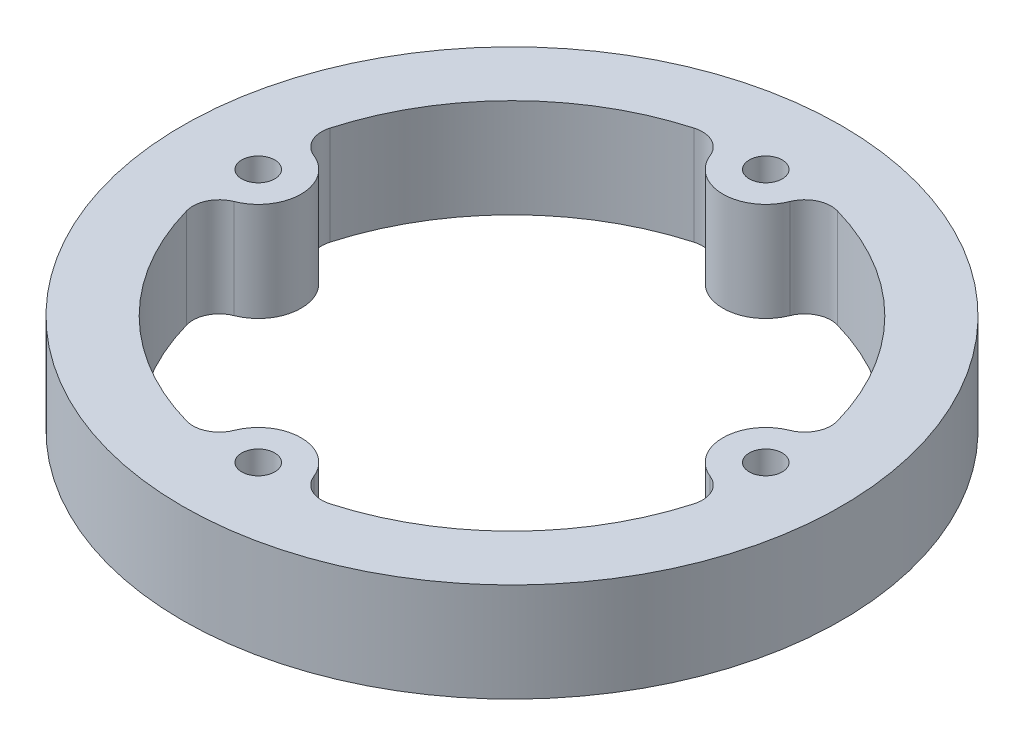
ISO-10303-21;
HEADER;
FILE_DESCRIPTION(('STEP AP214'),'2;1');
FILE_NAME('part.step','',(''),(''),'','','');
FILE_SCHEMA(('AUTOMOTIVE_DESIGN { 1 0 10303 214 1 1 1 1 }'));
ENDSEC;
DATA;
#1=APPLICATION_CONTEXT('core data for automotive mechanical design processes');
#2=APPLICATION_PROTOCOL_DEFINITION('international standard','automotive_design',2000,#1);
#3=PRODUCT_CONTEXT('',#1,'mechanical');
#4=PRODUCT('Part','Part','',(#3));
#5=PRODUCT_RELATED_PRODUCT_CATEGORY('part','',(#4));
#6=PRODUCT_DEFINITION_FORMATION('','',#4);
#7=PRODUCT_DEFINITION_CONTEXT('part definition',#1,'design');
#8=PRODUCT_DEFINITION('design','',#6,#7);
#9=PRODUCT_DEFINITION_SHAPE('','',#8);
#10=(LENGTH_UNIT() NAMED_UNIT(*) SI_UNIT(.MILLI.,.METRE.));
#11=(NAMED_UNIT(*) PLANE_ANGLE_UNIT() SI_UNIT($,.RADIAN.));
#12=(NAMED_UNIT(*) SI_UNIT($,.STERADIAN.) SOLID_ANGLE_UNIT());
#13=UNCERTAINTY_MEASURE_WITH_UNIT(LENGTH_MEASURE(1.E-05),#10,'distance_accuracy_value','');
#14=(GEOMETRIC_REPRESENTATION_CONTEXT(3) GLOBAL_UNCERTAINTY_ASSIGNED_CONTEXT((#13)) GLOBAL_UNIT_ASSIGNED_CONTEXT((#10,
#11,#12)) REPRESENTATION_CONTEXT('',''));
#15=CARTESIAN_POINT('',(0.,0.,0.));
#16=DIRECTION('',(0.,0.,1.));
#17=DIRECTION('',(1.,0.,0.));
#18=AXIS2_PLACEMENT_3D('',#15,#16,#17);
#19=CARTESIAN_POINT('',(0.,15.,0.));
#20=DIRECTION('',(0.,1.,0.));
#21=DIRECTION('',(0.,0.,1.));
#22=AXIS2_PLACEMENT_3D('',#19,#20,#21);
#23=PLANE('',#22);
#24=CARTESIAN_POINT('',(38.5,15.,0.));
#25=DIRECTION('',(0.,1.,0.));
#26=DIRECTION('',(0.,0.,1.));
#27=AXIS2_PLACEMENT_3D('',#24,#25,#26);
#28=CIRCLE('',#27,2.5);
#29=CARTESIAN_POINT('',(38.5,15.,2.5));
#30=VERTEX_POINT('',#29);
#31=EDGE_CURVE('E198',#30,#30,#28,.T.);
#32=ORIENTED_EDGE('',*,*,#31,.F.);
#33=EDGE_LOOP('',(#32));
#34=FACE_BOUND('',#33,.T.);
#35=CARTESIAN_POINT('',(-38.5,15.,0.));
#36=DIRECTION('',(0.,1.,0.));
#37=DIRECTION('',(0.,0.,-1.));
#38=AXIS2_PLACEMENT_3D('',#35,#36,#37);
#39=CIRCLE('',#38,2.5);
#40=CARTESIAN_POINT('',(-38.5,15.,-2.49999999999999));
#41=VERTEX_POINT('',#40);
#42=EDGE_CURVE('E204',#41,#41,#39,.T.);
#43=ORIENTED_EDGE('',*,*,#42,.F.);
#44=EDGE_LOOP('',(#43));
#45=FACE_BOUND('',#44,.T.);
#46=CARTESIAN_POINT('',(0.,15.,-38.5));
#47=DIRECTION('',(0.,1.,0.));
#48=DIRECTION('',(0.,0.,1.));
#49=AXIS2_PLACEMENT_3D('',#46,#47,#48);
#50=CIRCLE('',#49,2.5);
#51=CARTESIAN_POINT('',(0.,15.,-36.));
#52=VERTEX_POINT('',#51);
#53=EDGE_CURVE('E210',#52,#52,#50,.T.);
#54=ORIENTED_EDGE('',*,*,#53,.F.);
#55=EDGE_LOOP('',(#54));
#56=FACE_BOUND('',#55,.T.);
#57=CARTESIAN_POINT('',(0.,15.,38.5));
#58=DIRECTION('',(0.,1.,0.));
#59=DIRECTION('',(0.,0.,-1.));
#60=AXIS2_PLACEMENT_3D('',#57,#58,#59);
#61=CIRCLE('',#60,2.5);
#62=CARTESIAN_POINT('',(0.,15.,36.));
#63=VERTEX_POINT('',#62);
#64=EDGE_CURVE('E216',#63,#63,#61,.T.);
#65=ORIENTED_EDGE('',*,*,#64,.F.);
#66=EDGE_LOOP('',(#65));
#67=FACE_BOUND('',#66,.T.);
#68=CARTESIAN_POINT('',(0.,15.,0.));
#69=DIRECTION('',(0.,1.,0.));
#70=DIRECTION('',(0.,0.,1.));
#71=AXIS2_PLACEMENT_3D('',#68,#69,#70);
#72=CIRCLE('',#71,50.);
#73=CARTESIAN_POINT('',(0.,15.,50.));
#74=VERTEX_POINT('',#73);
#75=EDGE_CURVE('E220',#74,#74,#72,.T.);
#76=ORIENTED_EDGE('',*,*,#75,.T.);
#77=EDGE_LOOP('',(#76));
#78=FACE_BOUND('',#77,.T.);
#79=CARTESIAN_POINT('',(0.,15.,0.));
#80=DIRECTION('',(0.,1.,0.));
#81=DIRECTION('',(0.,0.,1.));
#82=AXIS2_PLACEMENT_3D('',#79,#80,#81);
#83=CIRCLE('',#82,40.);
#84=CARTESIAN_POINT('',(-38.4992784992785,15.,10.8538267461293));
#85=VERTEX_POINT('',#84);
#86=CARTESIAN_POINT('',(-10.8538267461293,15.,38.4992784992785));
#87=VERTEX_POINT('',#86);
#88=EDGE_CURVE('E187',#85,#87,#83,.T.);
#89=ORIENTED_EDGE('',*,*,#88,.F.);
#90=CARTESIAN_POINT('',(-34.6493506493507,15.,9.7684440715164));
#91=DIRECTION('',(0.,1.,0.));
#92=DIRECTION('',(0.,0.,1.));
#93=AXIS2_PLACEMENT_3D('',#90,#91,#92);
#94=CIRCLE('',#93,4.);
#95=CARTESIAN_POINT('',(-36.1162646876933,15.,6.04713204427206));
#96=VERTEX_POINT('',#95);
#97=EDGE_CURVE('E270',#85,#96,#94,.F.);
#98=ORIENTED_EDGE('',*,*,#97,.T.);
#99=CARTESIAN_POINT('',(-38.5,15.,0.));
#100=DIRECTION('',(0.,-1.,0.));
#101=DIRECTION('',(0.,0.,-1.));
#102=AXIS2_PLACEMENT_3D('',#99,#100,#101);
#103=CIRCLE('',#102,6.50000000000001);
#104=CARTESIAN_POINT('',(-36.1162646876933,15.,-6.04713204427206));
#105=VERTEX_POINT('',#104);
#106=EDGE_CURVE('E184',#105,#96,#103,.T.);
#107=ORIENTED_EDGE('',*,*,#106,.F.);
#108=CARTESIAN_POINT('',(-34.6493506493507,15.,-9.7684440715164));
#109=DIRECTION('',(0.,1.,0.));
#110=DIRECTION('',(0.,0.,1.));
#111=AXIS2_PLACEMENT_3D('',#108,#109,#110);
#112=CIRCLE('',#111,4.);
#113=CARTESIAN_POINT('',(-38.4992784992785,15.,-10.8538267461293));
#114=VERTEX_POINT('',#113);
#115=EDGE_CURVE('E274',#105,#114,#112,.F.);
#116=ORIENTED_EDGE('',*,*,#115,.T.);
#117=CARTESIAN_POINT('',(0.,15.,0.));
#118=DIRECTION('',(0.,1.,0.));
#119=DIRECTION('',(0.,0.,1.));
#120=AXIS2_PLACEMENT_3D('',#117,#118,#119);
#121=CIRCLE('',#120,40.);
#122=CARTESIAN_POINT('',(-10.8538267461294,15.,-38.4992784992785));
#123=VERTEX_POINT('',#122);
#124=EDGE_CURVE('E176',#123,#114,#121,.T.);
#125=ORIENTED_EDGE('',*,*,#124,.F.);
#126=CARTESIAN_POINT('',(-9.76844407151643,15.,-34.6493506493506));
#127=DIRECTION('',(0.,1.,0.));
#128=DIRECTION('',(0.,0.,1.));
#129=AXIS2_PLACEMENT_3D('',#126,#127,#128);
#130=CIRCLE('',#129,4.);
#131=CARTESIAN_POINT('',(-6.04713204427208,15.,-36.1162646876933));
#132=VERTEX_POINT('',#131);
#133=EDGE_CURVE('E52',#123,#132,#130,.F.);
#134=ORIENTED_EDGE('',*,*,#133,.T.);
#135=CARTESIAN_POINT('',(0.,15.,-38.5));
#136=DIRECTION('',(0.,-1.,0.));
#137=DIRECTION('',(0.,0.,-1.));
#138=AXIS2_PLACEMENT_3D('',#135,#136,#137);
#139=CIRCLE('',#138,6.5);
#140=CARTESIAN_POINT('',(6.04713204427203,15.,-36.1162646876933));
#141=VERTEX_POINT('',#140);
#142=EDGE_CURVE('E173',#141,#132,#139,.T.);
#143=ORIENTED_EDGE('',*,*,#142,.F.);
#144=CARTESIAN_POINT('',(9.76844407151637,15.,-34.6493506493507));
#145=DIRECTION('',(0.,1.,0.));
#146=DIRECTION('',(0.,0.,1.));
#147=AXIS2_PLACEMENT_3D('',#144,#145,#146);
#148=CIRCLE('',#147,4.);
#149=CARTESIAN_POINT('',(10.8538267461293,15.,-38.4992784992785));
#150=VERTEX_POINT('',#149);
#151=EDGE_CURVE('E45',#141,#150,#148,.F.);
#152=ORIENTED_EDGE('',*,*,#151,.T.);
#153=CARTESIAN_POINT('',(0.,15.,0.));
#154=DIRECTION('',(0.,1.,0.));
#155=DIRECTION('',(0.,0.,1.));
#156=AXIS2_PLACEMENT_3D('',#153,#154,#155);
#157=CIRCLE('',#156,40.);
#158=CARTESIAN_POINT('',(38.4992784992785,15.,-10.8538267461293));
#159=VERTEX_POINT('',#158);
#160=EDGE_CURVE('E166',#159,#150,#157,.T.);
#161=ORIENTED_EDGE('',*,*,#160,.F.);
#162=CARTESIAN_POINT('',(34.6493506493507,15.,-9.7684440715164));
#163=DIRECTION('',(0.,1.,0.));
#164=DIRECTION('',(0.,0.,1.));
#165=AXIS2_PLACEMENT_3D('',#162,#163,#164);
#166=CIRCLE('',#165,4.);
#167=CARTESIAN_POINT('',(36.1162646876933,15.,-6.04713204427206));
#168=VERTEX_POINT('',#167);
#169=EDGE_CURVE('E150',#159,#168,#166,.F.);
#170=ORIENTED_EDGE('',*,*,#169,.T.);
#171=CARTESIAN_POINT('',(38.5,15.,0.));
#172=DIRECTION('',(0.,-1.,0.));
#173=DIRECTION('',(0.,0.,1.));
#174=AXIS2_PLACEMENT_3D('',#171,#172,#173);
#175=CIRCLE('',#174,6.50000000000001);
#176=CARTESIAN_POINT('',(36.1162646876933,15.,6.04713204427206));
#177=VERTEX_POINT('',#176);
#178=EDGE_CURVE('E174',#177,#168,#175,.T.);
#179=ORIENTED_EDGE('',*,*,#178,.F.);
#180=CARTESIAN_POINT('',(34.6493506493507,15.,9.7684440715164));
#181=DIRECTION('',(0.,1.,0.));
#182=DIRECTION('',(0.,0.,1.));
#183=AXIS2_PLACEMENT_3D('',#180,#181,#182);
#184=CIRCLE('',#183,4.);
#185=CARTESIAN_POINT('',(38.4992784992785,15.,10.8538267461293));
#186=VERTEX_POINT('',#185);
#187=EDGE_CURVE('E258',#177,#186,#184,.F.);
#188=ORIENTED_EDGE('',*,*,#187,.T.);
#189=CARTESIAN_POINT('',(0.,15.,0.));
#190=DIRECTION('',(0.,1.,0.));
#191=DIRECTION('',(0.,0.,1.));
#192=AXIS2_PLACEMENT_3D('',#189,#190,#191);
#193=CIRCLE('',#192,40.);
#194=CARTESIAN_POINT('',(10.8538267461293,15.,38.4992784992785));
#195=VERTEX_POINT('',#194);
#196=EDGE_CURVE('E178',#195,#186,#193,.T.);
#197=ORIENTED_EDGE('',*,*,#196,.F.);
#198=CARTESIAN_POINT('',(9.7684440715164,15.,34.6493506493507));
#199=DIRECTION('',(0.,1.,0.));
#200=DIRECTION('',(0.,0.,1.));
#201=AXIS2_PLACEMENT_3D('',#198,#199,#200);
#202=CIRCLE('',#201,4.);
#203=CARTESIAN_POINT('',(6.04713204427205,15.,36.1162646876933));
#204=VERTEX_POINT('',#203);
#205=EDGE_CURVE('E262',#195,#204,#202,.F.);
#206=ORIENTED_EDGE('',*,*,#205,.T.);
#207=CARTESIAN_POINT('',(0.,15.,38.5));
#208=DIRECTION('',(0.,-1.,0.));
#209=DIRECTION('',(0.,0.,1.));
#210=AXIS2_PLACEMENT_3D('',#207,#208,#209);
#211=CIRCLE('',#210,6.5);
#212=CARTESIAN_POINT('',(-6.04713204427205,15.,36.1162646876933));
#213=VERTEX_POINT('',#212);
#214=EDGE_CURVE('E190',#213,#204,#211,.T.);
#215=ORIENTED_EDGE('',*,*,#214,.F.);
#216=CARTESIAN_POINT('',(-9.76844407151639,15.,34.6493506493507));
#217=DIRECTION('',(0.,1.,0.));
#218=DIRECTION('',(0.,0.,1.));
#219=AXIS2_PLACEMENT_3D('',#216,#217,#218);
#220=CIRCLE('',#219,4.);
#221=EDGE_CURVE('E266',#213,#87,#220,.F.);
#222=ORIENTED_EDGE('',*,*,#221,.T.);
#223=EDGE_LOOP('',(#89,#98,#107,#116,#125,#134,#143,#152,#161,#170,#179,#188,#197,#206,#215,#222));
#224=FACE_BOUND('',#223,.T.);
#225=ADVANCED_FACE('F37',(#34,#45,#56,#67,#78,#224),#23,.T.);
#226=CARTESIAN_POINT('',(0.,0.,0.));
#227=DIRECTION('',(0.,1.,0.));
#228=DIRECTION('',(0.,0.,1.));
#229=AXIS2_PLACEMENT_3D('',#226,#227,#228);
#230=PLANE('',#229);
#231=CARTESIAN_POINT('',(38.5,0.,0.));
#232=DIRECTION('',(0.,1.,0.));
#233=DIRECTION('',(0.,0.,1.));
#234=AXIS2_PLACEMENT_3D('',#231,#232,#233);
#235=CIRCLE('',#234,2.5);
#236=CARTESIAN_POINT('',(38.5,0.,2.5));
#237=VERTEX_POINT('',#236);
#238=EDGE_CURVE('E194',#237,#237,#235,.T.);
#239=ORIENTED_EDGE('',*,*,#238,.T.);
#240=EDGE_LOOP('',(#239));
#241=FACE_BOUND('',#240,.T.);
#242=CARTESIAN_POINT('',(-38.5,0.,0.));
#243=DIRECTION('',(0.,1.,0.));
#244=DIRECTION('',(0.,0.,-1.));
#245=AXIS2_PLACEMENT_3D('',#242,#243,#244);
#246=CIRCLE('',#245,2.5);
#247=CARTESIAN_POINT('',(-38.5,0.,-2.49999999999999));
#248=VERTEX_POINT('',#247);
#249=EDGE_CURVE('E201',#248,#248,#246,.T.);
#250=ORIENTED_EDGE('',*,*,#249,.T.);
#251=EDGE_LOOP('',(#250));
#252=FACE_BOUND('',#251,.T.);
#253=CARTESIAN_POINT('',(0.,0.,-38.5));
#254=DIRECTION('',(0.,1.,0.));
#255=DIRECTION('',(0.,0.,1.));
#256=AXIS2_PLACEMENT_3D('',#253,#254,#255);
#257=CIRCLE('',#256,2.5);
#258=CARTESIAN_POINT('',(0.,0.,-36.));
#259=VERTEX_POINT('',#258);
#260=EDGE_CURVE('E207',#259,#259,#257,.T.);
#261=ORIENTED_EDGE('',*,*,#260,.T.);
#262=EDGE_LOOP('',(#261));
#263=FACE_BOUND('',#262,.T.);
#264=CARTESIAN_POINT('',(0.,0.,38.5));
#265=DIRECTION('',(0.,1.,0.));
#266=DIRECTION('',(0.,0.,-1.));
#267=AXIS2_PLACEMENT_3D('',#264,#265,#266);
#268=CIRCLE('',#267,2.5);
#269=CARTESIAN_POINT('',(0.,0.,36.));
#270=VERTEX_POINT('',#269);
#271=EDGE_CURVE('E213',#270,#270,#268,.T.);
#272=ORIENTED_EDGE('',*,*,#271,.T.);
#273=EDGE_LOOP('',(#272));
#274=FACE_BOUND('',#273,.T.);
#275=CARTESIAN_POINT('',(0.,0.,0.));
#276=DIRECTION('',(0.,1.,0.));
#277=DIRECTION('',(0.,0.,1.));
#278=AXIS2_PLACEMENT_3D('',#275,#276,#277);
#279=CIRCLE('',#278,50.);
#280=CARTESIAN_POINT('',(0.,0.,50.));
#281=VERTEX_POINT('',#280);
#282=EDGE_CURVE('E197',#281,#281,#279,.T.);
#283=ORIENTED_EDGE('',*,*,#282,.F.);
#284=EDGE_LOOP('',(#283));
#285=FACE_BOUND('',#284,.T.);
#286=CARTESIAN_POINT('',(0.,0.,0.));
#287=DIRECTION('',(0.,1.,0.));
#288=DIRECTION('',(0.,0.,1.));
#289=AXIS2_PLACEMENT_3D('',#286,#287,#288);
#290=CIRCLE('',#289,40.);
#291=CARTESIAN_POINT('',(-10.8538267461294,0.,-38.4992784992785));
#292=VERTEX_POINT('',#291);
#293=CARTESIAN_POINT('',(-38.4992784992785,0.,-10.8538267461293));
#294=VERTEX_POINT('',#293);
#295=EDGE_CURVE('E286',#292,#294,#290,.T.);
#296=ORIENTED_EDGE('',*,*,#295,.T.);
#297=CARTESIAN_POINT('',(-34.6493506493507,0.,-9.7684440715164));
#298=DIRECTION('',(0.,1.,0.));
#299=DIRECTION('',(0.,0.,1.));
#300=AXIS2_PLACEMENT_3D('',#297,#298,#299);
#301=CIRCLE('',#300,4.);
#302=CARTESIAN_POINT('',(-36.1162646876933,0.,-6.04713204427206));
#303=VERTEX_POINT('',#302);
#304=EDGE_CURVE('E276',#294,#303,#301,.T.);
#305=ORIENTED_EDGE('',*,*,#304,.T.);
#306=CARTESIAN_POINT('',(-38.5,0.,0.));
#307=DIRECTION('',(0.,-1.,0.));
#308=DIRECTION('',(0.,0.,-1.));
#309=AXIS2_PLACEMENT_3D('',#306,#307,#308);
#310=CIRCLE('',#309,6.50000000000001);
#311=CARTESIAN_POINT('',(-36.1162646876933,0.,6.04713204427206));
#312=VERTEX_POINT('',#311);
#313=EDGE_CURVE('E296',#303,#312,#310,.T.);
#314=ORIENTED_EDGE('',*,*,#313,.T.);
#315=CARTESIAN_POINT('',(-34.6493506493507,0.,9.7684440715164));
#316=DIRECTION('',(0.,1.,0.));
#317=DIRECTION('',(0.,0.,1.));
#318=AXIS2_PLACEMENT_3D('',#315,#316,#317);
#319=CIRCLE('',#318,4.);
#320=CARTESIAN_POINT('',(-38.4992784992785,0.,10.8538267461293));
#321=VERTEX_POINT('',#320);
#322=EDGE_CURVE('E272',#312,#321,#319,.T.);
#323=ORIENTED_EDGE('',*,*,#322,.T.);
#324=CARTESIAN_POINT('',(0.,0.,0.));
#325=DIRECTION('',(0.,1.,0.));
#326=DIRECTION('',(0.,0.,1.));
#327=AXIS2_PLACEMENT_3D('',#324,#325,#326);
#328=CIRCLE('',#327,40.);
#329=CARTESIAN_POINT('',(-10.8538267461293,0.,38.4992784992785));
#330=VERTEX_POINT('',#329);
#331=EDGE_CURVE('E311',#321,#330,#328,.T.);
#332=ORIENTED_EDGE('',*,*,#331,.T.);
#333=CARTESIAN_POINT('',(-9.76844407151639,0.,34.6493506493507));
#334=DIRECTION('',(0.,1.,0.));
#335=DIRECTION('',(0.,0.,1.));
#336=AXIS2_PLACEMENT_3D('',#333,#334,#335);
#337=CIRCLE('',#336,4.);
#338=CARTESIAN_POINT('',(-6.04713204427205,0.,36.1162646876933));
#339=VERTEX_POINT('',#338);
#340=EDGE_CURVE('E268',#330,#339,#337,.T.);
#341=ORIENTED_EDGE('',*,*,#340,.T.);
#342=CARTESIAN_POINT('',(0.,0.,38.5));
#343=DIRECTION('',(0.,-1.,0.));
#344=DIRECTION('',(0.,0.,1.));
#345=AXIS2_PLACEMENT_3D('',#342,#343,#344);
#346=CIRCLE('',#345,6.5);
#347=CARTESIAN_POINT('',(6.04713204427205,0.,36.1162646876933));
#348=VERTEX_POINT('',#347);
#349=EDGE_CURVE('E219',#339,#348,#346,.T.);
#350=ORIENTED_EDGE('',*,*,#349,.T.);
#351=CARTESIAN_POINT('',(9.7684440715164,0.,34.6493506493507));
#352=DIRECTION('',(0.,1.,0.));
#353=DIRECTION('',(0.,0.,1.));
#354=AXIS2_PLACEMENT_3D('',#351,#352,#353);
#355=CIRCLE('',#354,4.);
#356=CARTESIAN_POINT('',(10.8538267461293,0.,38.4992784992785));
#357=VERTEX_POINT('',#356);
#358=EDGE_CURVE('E264',#348,#357,#355,.T.);
#359=ORIENTED_EDGE('',*,*,#358,.T.);
#360=CARTESIAN_POINT('',(0.,0.,0.));
#361=DIRECTION('',(0.,1.,0.));
#362=DIRECTION('',(0.,0.,1.));
#363=AXIS2_PLACEMENT_3D('',#360,#361,#362);
#364=CIRCLE('',#363,40.);
#365=CARTESIAN_POINT('',(38.4992784992785,0.,10.8538267461293));
#366=VERTEX_POINT('',#365);
#367=EDGE_CURVE('E193',#357,#366,#364,.T.);
#368=ORIENTED_EDGE('',*,*,#367,.T.);
#369=CARTESIAN_POINT('',(34.6493506493507,0.,9.7684440715164));
#370=DIRECTION('',(0.,1.,0.));
#371=DIRECTION('',(0.,0.,1.));
#372=AXIS2_PLACEMENT_3D('',#369,#370,#371);
#373=CIRCLE('',#372,4.);
#374=CARTESIAN_POINT('',(36.1162646876933,0.,6.04713204427206));
#375=VERTEX_POINT('',#374);
#376=EDGE_CURVE('E260',#366,#375,#373,.T.);
#377=ORIENTED_EDGE('',*,*,#376,.T.);
#378=CARTESIAN_POINT('',(38.5,0.,0.));
#379=DIRECTION('',(0.,-1.,0.));
#380=DIRECTION('',(0.,0.,1.));
#381=AXIS2_PLACEMENT_3D('',#378,#379,#380);
#382=CIRCLE('',#381,6.50000000000001);
#383=CARTESIAN_POINT('',(36.1162646876933,0.,-6.04713204427206));
#384=VERTEX_POINT('',#383);
#385=EDGE_CURVE('E303',#375,#384,#382,.T.);
#386=ORIENTED_EDGE('',*,*,#385,.T.);
#387=CARTESIAN_POINT('',(34.6493506493507,0.,-9.7684440715164));
#388=DIRECTION('',(0.,1.,0.));
#389=DIRECTION('',(0.,0.,1.));
#390=AXIS2_PLACEMENT_3D('',#387,#388,#389);
#391=CIRCLE('',#390,4.);
#392=CARTESIAN_POINT('',(38.4992784992785,0.,-10.8538267461293));
#393=VERTEX_POINT('',#392);
#394=EDGE_CURVE('E159',#384,#393,#391,.T.);
#395=ORIENTED_EDGE('',*,*,#394,.T.);
#396=CARTESIAN_POINT('',(0.,0.,0.));
#397=DIRECTION('',(0.,1.,0.));
#398=DIRECTION('',(0.,0.,1.));
#399=AXIS2_PLACEMENT_3D('',#396,#397,#398);
#400=CIRCLE('',#399,40.);
#401=CARTESIAN_POINT('',(10.8538267461293,0.,-38.4992784992785));
#402=VERTEX_POINT('',#401);
#403=EDGE_CURVE('E168',#393,#402,#400,.T.);
#404=ORIENTED_EDGE('',*,*,#403,.T.);
#405=CARTESIAN_POINT('',(9.76844407151637,0.,-34.6493506493507));
#406=DIRECTION('',(0.,1.,0.));
#407=DIRECTION('',(0.,0.,1.));
#408=AXIS2_PLACEMENT_3D('',#405,#406,#407);
#409=CIRCLE('',#408,4.);
#410=CARTESIAN_POINT('',(6.04713204427203,0.,-36.1162646876933));
#411=VERTEX_POINT('',#410);
#412=EDGE_CURVE('E11',#402,#411,#409,.T.);
#413=ORIENTED_EDGE('',*,*,#412,.T.);
#414=CARTESIAN_POINT('',(0.,0.,-38.5));
#415=DIRECTION('',(0.,-1.,0.));
#416=DIRECTION('',(0.,0.,-1.));
#417=AXIS2_PLACEMENT_3D('',#414,#415,#416);
#418=CIRCLE('',#417,6.5);
#419=CARTESIAN_POINT('',(-6.04713204427208,0.,-36.1162646876933));
#420=VERTEX_POINT('',#419);
#421=EDGE_CURVE('E289',#411,#420,#418,.T.);
#422=ORIENTED_EDGE('',*,*,#421,.T.);
#423=CARTESIAN_POINT('',(-9.76844407151643,0.,-34.6493506493506));
#424=DIRECTION('',(0.,1.,0.));
#425=DIRECTION('',(0.,0.,1.));
#426=AXIS2_PLACEMENT_3D('',#423,#424,#425);
#427=CIRCLE('',#426,4.);
#428=EDGE_CURVE('E279',#420,#292,#427,.T.);
#429=ORIENTED_EDGE('',*,*,#428,.T.);
#430=EDGE_LOOP('',(#296,#305,#314,#323,#332,#341,#350,#359,#368,#377,#386,#395,#404,#413,#422,#429));
#431=FACE_BOUND('',#430,.T.);
#432=ADVANCED_FACE('F285',(#241,#252,#263,#274,#285,#431),#230,.F.);
#433=CARTESIAN_POINT('',(0.,15.,0.));
#434=DIRECTION('',(0.,-1.,0.));
#435=DIRECTION('',(0.,0.,-1.));
#436=AXIS2_PLACEMENT_3D('',#433,#434,#435);
#437=CYLINDRICAL_SURFACE('',#436,50.);
#438=ORIENTED_EDGE('',*,*,#75,.F.);
#439=EDGE_LOOP('',(#438));
#440=FACE_BOUND('',#439,.T.);
#441=ORIENTED_EDGE('',*,*,#282,.T.);
#442=EDGE_LOOP('',(#441));
#443=FACE_BOUND('',#442,.T.);
#444=ADVANCED_FACE('F347',(#440,#443),#437,.T.);
#445=CARTESIAN_POINT('',(0.,0.,38.5));
#446=DIRECTION('',(0.,1.,0.));
#447=DIRECTION('',(0.,0.,1.));
#448=AXIS2_PLACEMENT_3D('',#445,#446,#447);
#449=CYLINDRICAL_SURFACE('',#448,2.5);
#450=ORIENTED_EDGE('',*,*,#271,.F.);
#451=EDGE_LOOP('',(#450));
#452=FACE_BOUND('',#451,.T.);
#453=ORIENTED_EDGE('',*,*,#64,.T.);
#454=EDGE_LOOP('',(#453));
#455=FACE_BOUND('',#454,.T.);
#456=ADVANCED_FACE('F353',(#452,#455),#449,.F.);
#457=CARTESIAN_POINT('',(0.,0.,-38.5));
#458=DIRECTION('',(0.,1.,0.));
#459=DIRECTION('',(0.,0.,1.));
#460=AXIS2_PLACEMENT_3D('',#457,#458,#459);
#461=CYLINDRICAL_SURFACE('',#460,2.5);
#462=ORIENTED_EDGE('',*,*,#260,.F.);
#463=EDGE_LOOP('',(#462));
#464=FACE_BOUND('',#463,.T.);
#465=ORIENTED_EDGE('',*,*,#53,.T.);
#466=EDGE_LOOP('',(#465));
#467=FACE_BOUND('',#466,.T.);
#468=ADVANCED_FACE('F513',(#464,#467),#461,.F.);
#469=CARTESIAN_POINT('',(-38.5,0.,0.));
#470=DIRECTION('',(0.,1.,0.));
#471=DIRECTION('',(0.,0.,1.));
#472=AXIS2_PLACEMENT_3D('',#469,#470,#471);
#473=CYLINDRICAL_SURFACE('',#472,2.5);
#474=ORIENTED_EDGE('',*,*,#249,.F.);
#475=EDGE_LOOP('',(#474));
#476=FACE_BOUND('',#475,.T.);
#477=ORIENTED_EDGE('',*,*,#42,.T.);
#478=EDGE_LOOP('',(#477));
#479=FACE_BOUND('',#478,.T.);
#480=ADVANCED_FACE('F503',(#476,#479),#473,.F.);
#481=CARTESIAN_POINT('',(38.5,0.,0.));
#482=DIRECTION('',(0.,1.,0.));
#483=DIRECTION('',(0.,0.,1.));
#484=AXIS2_PLACEMENT_3D('',#481,#482,#483);
#485=CYLINDRICAL_SURFACE('',#484,2.5);
#486=ORIENTED_EDGE('',*,*,#238,.F.);
#487=EDGE_LOOP('',(#486));
#488=FACE_BOUND('',#487,.T.);
#489=ORIENTED_EDGE('',*,*,#31,.T.);
#490=EDGE_LOOP('',(#489));
#491=FACE_BOUND('',#490,.T.);
#492=ADVANCED_FACE('F483',(#488,#491),#485,.F.);
#493=CARTESIAN_POINT('',(0.,0.,38.5));
#494=DIRECTION('',(0.,1.,0.));
#495=DIRECTION('',(0.,0.,1.));
#496=AXIS2_PLACEMENT_3D('',#493,#494,#495);
#497=CYLINDRICAL_SURFACE('',#496,6.5);
#498=ORIENTED_EDGE('',*,*,#214,.T.);
#499=DIRECTION('',(0.,1.,0.));
#500=VECTOR('',#499,1.);
#501=CARTESIAN_POINT('',(6.04713204427205,0.,36.1162646876933));
#502=LINE('',#501,#500);
#503=EDGE_CURVE('E237',#204,#348,#502,.F.);
#504=ORIENTED_EDGE('',*,*,#503,.T.);
#505=ORIENTED_EDGE('',*,*,#349,.F.);
#506=DIRECTION('',(0.,1.,0.));
#507=VECTOR('',#506,1.);
#508=CARTESIAN_POINT('',(-6.04713204427205,0.,36.1162646876933));
#509=LINE('',#508,#507);
#510=EDGE_CURVE('E234',#339,#213,#509,.T.);
#511=ORIENTED_EDGE('',*,*,#510,.T.);
#512=EDGE_LOOP('',(#498,#504,#505,#511));
#513=FACE_BOUND('',#512,.T.);
#514=ADVANCED_FACE('F473',(#513),#497,.T.);
#515=CARTESIAN_POINT('',(-38.5,0.,0.));
#516=DIRECTION('',(0.,1.,0.));
#517=DIRECTION('',(0.,0.,1.));
#518=AXIS2_PLACEMENT_3D('',#515,#516,#517);
#519=CYLINDRICAL_SURFACE('',#518,6.50000000000001);
#520=ORIENTED_EDGE('',*,*,#106,.T.);
#521=DIRECTION('',(0.,1.,0.));
#522=VECTOR('',#521,1.);
#523=CARTESIAN_POINT('',(-36.1162646876933,0.,6.04713204427206));
#524=LINE('',#523,#522);
#525=EDGE_CURVE('E247',#96,#312,#524,.F.);
#526=ORIENTED_EDGE('',*,*,#525,.T.);
#527=ORIENTED_EDGE('',*,*,#313,.F.);
#528=DIRECTION('',(0.,1.,0.));
#529=VECTOR('',#528,1.);
#530=CARTESIAN_POINT('',(-36.1162646876933,0.,-6.04713204427206));
#531=LINE('',#530,#529);
#532=EDGE_CURVE('E244',#303,#105,#531,.T.);
#533=ORIENTED_EDGE('',*,*,#532,.T.);
#534=EDGE_LOOP('',(#520,#526,#527,#533));
#535=FACE_BOUND('',#534,.T.);
#536=ADVANCED_FACE('F338',(#535),#519,.T.);
#537=CARTESIAN_POINT('',(0.,0.,-38.5));
#538=DIRECTION('',(0.,1.,0.));
#539=DIRECTION('',(0.,0.,1.));
#540=AXIS2_PLACEMENT_3D('',#537,#538,#539);
#541=CYLINDRICAL_SURFACE('',#540,6.5);
#542=ORIENTED_EDGE('',*,*,#142,.T.);
#543=DIRECTION('',(0.,1.,0.));
#544=VECTOR('',#543,1.);
#545=CARTESIAN_POINT('',(-6.04713204427208,0.,-36.1162646876933));
#546=LINE('',#545,#544);
#547=EDGE_CURVE('E160',#132,#420,#546,.F.);
#548=ORIENTED_EDGE('',*,*,#547,.T.);
#549=ORIENTED_EDGE('',*,*,#421,.F.);
#550=DIRECTION('',(0.,1.,0.));
#551=VECTOR('',#550,1.);
#552=CARTESIAN_POINT('',(6.04713204427203,0.,-36.1162646876933));
#553=LINE('',#552,#551);
#554=EDGE_CURVE('E254',#411,#141,#553,.T.);
#555=ORIENTED_EDGE('',*,*,#554,.T.);
#556=EDGE_LOOP('',(#542,#548,#549,#555));
#557=FACE_BOUND('',#556,.T.);
#558=ADVANCED_FACE('F300',(#557),#541,.T.);
#559=CARTESIAN_POINT('',(38.5,0.,0.));
#560=DIRECTION('',(0.,1.,0.));
#561=DIRECTION('',(0.,0.,1.));
#562=AXIS2_PLACEMENT_3D('',#559,#560,#561);
#563=CYLINDRICAL_SURFACE('',#562,6.50000000000001);
#564=ORIENTED_EDGE('',*,*,#178,.T.);
#565=DIRECTION('',(0.,1.,0.));
#566=VECTOR('',#565,1.);
#567=CARTESIAN_POINT('',(36.1162646876933,0.,-6.04713204427206));
#568=LINE('',#567,#566);
#569=EDGE_CURVE('E155',#168,#384,#568,.F.);
#570=ORIENTED_EDGE('',*,*,#569,.T.);
#571=ORIENTED_EDGE('',*,*,#385,.F.);
#572=DIRECTION('',(0.,1.,0.));
#573=VECTOR('',#572,1.);
#574=CARTESIAN_POINT('',(36.1162646876933,0.,6.04713204427206));
#575=LINE('',#574,#573);
#576=EDGE_CURVE('E169',#375,#177,#575,.T.);
#577=ORIENTED_EDGE('',*,*,#576,.T.);
#578=EDGE_LOOP('',(#564,#570,#571,#577));
#579=FACE_BOUND('',#578,.T.);
#580=ADVANCED_FACE('F329',(#579),#563,.T.);
#581=CARTESIAN_POINT('',(0.,0.,0.));
#582=DIRECTION('',(0.,1.,0.));
#583=DIRECTION('',(0.,0.,1.));
#584=AXIS2_PLACEMENT_3D('',#581,#582,#583);
#585=CYLINDRICAL_SURFACE('',#584,40.);
#586=ORIENTED_EDGE('',*,*,#196,.T.);
#587=DIRECTION('',(0.,1.,0.));
#588=VECTOR('',#587,1.);
#589=CARTESIAN_POINT('',(38.4992784992785,0.,10.8538267461293));
#590=LINE('',#589,#588);
#591=EDGE_CURVE('E232',#186,#366,#590,.F.);
#592=ORIENTED_EDGE('',*,*,#591,.T.);
#593=ORIENTED_EDGE('',*,*,#367,.F.);
#594=DIRECTION('',(0.,1.,0.));
#595=VECTOR('',#594,1.);
#596=CARTESIAN_POINT('',(10.8538267461293,0.,38.4992784992785));
#597=LINE('',#596,#595);
#598=EDGE_CURVE('E229',#357,#195,#597,.T.);
#599=ORIENTED_EDGE('',*,*,#598,.T.);
#600=EDGE_LOOP('',(#586,#592,#593,#599));
#601=FACE_BOUND('',#600,.T.);
#602=ADVANCED_FACE('F319',(#601),#585,.F.);
#603=CARTESIAN_POINT('',(0.,0.,0.));
#604=DIRECTION('',(0.,1.,0.));
#605=DIRECTION('',(0.,0.,1.));
#606=AXIS2_PLACEMENT_3D('',#603,#604,#605);
#607=CYLINDRICAL_SURFACE('',#606,40.);
#608=ORIENTED_EDGE('',*,*,#88,.T.);
#609=DIRECTION('',(0.,1.,0.));
#610=VECTOR('',#609,1.);
#611=CARTESIAN_POINT('',(-10.8538267461293,0.,38.4992784992785));
#612=LINE('',#611,#610);
#613=EDGE_CURVE('E242',#87,#330,#612,.F.);
#614=ORIENTED_EDGE('',*,*,#613,.T.);
#615=ORIENTED_EDGE('',*,*,#331,.F.);
#616=DIRECTION('',(0.,1.,0.));
#617=VECTOR('',#616,1.);
#618=CARTESIAN_POINT('',(-38.4992784992785,0.,10.8538267461293));
#619=LINE('',#618,#617);
#620=EDGE_CURVE('E239',#321,#85,#619,.T.);
#621=ORIENTED_EDGE('',*,*,#620,.T.);
#622=EDGE_LOOP('',(#608,#614,#615,#621));
#623=FACE_BOUND('',#622,.T.);
#624=ADVANCED_FACE('F336',(#623),#607,.F.);
#625=CARTESIAN_POINT('',(0.,0.,0.));
#626=DIRECTION('',(0.,1.,0.));
#627=DIRECTION('',(0.,0.,1.));
#628=AXIS2_PLACEMENT_3D('',#625,#626,#627);
#629=CYLINDRICAL_SURFACE('',#628,40.);
#630=ORIENTED_EDGE('',*,*,#124,.T.);
#631=DIRECTION('',(0.,1.,0.));
#632=VECTOR('',#631,1.);
#633=CARTESIAN_POINT('',(-38.4992784992785,0.,-10.8538267461293));
#634=LINE('',#633,#632);
#635=EDGE_CURVE('E252',#114,#294,#634,.F.);
#636=ORIENTED_EDGE('',*,*,#635,.T.);
#637=ORIENTED_EDGE('',*,*,#295,.F.);
#638=DIRECTION('',(0.,1.,0.));
#639=VECTOR('',#638,1.);
#640=CARTESIAN_POINT('',(-10.8538267461294,0.,-38.4992784992785));
#641=LINE('',#640,#639);
#642=EDGE_CURVE('E249',#292,#123,#641,.T.);
#643=ORIENTED_EDGE('',*,*,#642,.T.);
#644=EDGE_LOOP('',(#630,#636,#637,#643));
#645=FACE_BOUND('',#644,.T.);
#646=ADVANCED_FACE('F294',(#645),#629,.F.);
#647=CARTESIAN_POINT('',(0.,0.,0.));
#648=DIRECTION('',(0.,1.,0.));
#649=DIRECTION('',(0.,0.,1.));
#650=AXIS2_PLACEMENT_3D('',#647,#648,#649);
#651=CYLINDRICAL_SURFACE('',#650,40.);
#652=ORIENTED_EDGE('',*,*,#403,.F.);
#653=DIRECTION('',(0.,1.,0.));
#654=VECTOR('',#653,1.);
#655=CARTESIAN_POINT('',(38.4992784992785,0.,-10.8538267461293));
#656=LINE('',#655,#654);
#657=EDGE_CURVE('E154',#393,#159,#656,.T.);
#658=ORIENTED_EDGE('',*,*,#657,.T.);
#659=ORIENTED_EDGE('',*,*,#160,.T.);
#660=DIRECTION('',(0.,1.,0.));
#661=VECTOR('',#660,1.);
#662=CARTESIAN_POINT('',(10.8538267461293,0.,-38.4992784992785));
#663=LINE('',#662,#661);
#664=EDGE_CURVE('E170',#150,#402,#663,.F.);
#665=ORIENTED_EDGE('',*,*,#664,.T.);
#666=EDGE_LOOP('',(#652,#658,#659,#665));
#667=FACE_BOUND('',#666,.T.);
#668=ADVANCED_FACE('F165',(#667),#651,.F.);
#669=CARTESIAN_POINT('',(34.6493506493507,0.,-9.7684440715164));
#670=DIRECTION('',(0.,1.,0.));
#671=DIRECTION('',(0.,0.,1.));
#672=AXIS2_PLACEMENT_3D('',#669,#670,#671);
#673=CYLINDRICAL_SURFACE('',#672,4.);
#674=ORIENTED_EDGE('',*,*,#394,.F.);
#675=ORIENTED_EDGE('',*,*,#569,.F.);
#676=ORIENTED_EDGE('',*,*,#169,.F.);
#677=ORIENTED_EDGE('',*,*,#657,.F.);
#678=EDGE_LOOP('',(#674,#675,#676,#677));
#679=FACE_BOUND('',#678,.T.);
#680=ADVANCED_FACE('F153',(#679),#673,.F.);
#681=CARTESIAN_POINT('',(34.6493506493507,0.,9.7684440715164));
#682=DIRECTION('',(0.,1.,0.));
#683=DIRECTION('',(0.,0.,1.));
#684=AXIS2_PLACEMENT_3D('',#681,#682,#683);
#685=CYLINDRICAL_SURFACE('',#684,4.);
#686=ORIENTED_EDGE('',*,*,#376,.F.);
#687=ORIENTED_EDGE('',*,*,#591,.F.);
#688=ORIENTED_EDGE('',*,*,#187,.F.);
#689=ORIENTED_EDGE('',*,*,#576,.F.);
#690=EDGE_LOOP('',(#686,#687,#688,#689));
#691=FACE_BOUND('',#690,.T.);
#692=ADVANCED_FACE('F325',(#691),#685,.F.);
#693=CARTESIAN_POINT('',(9.7684440715164,0.,34.6493506493507));
#694=DIRECTION('',(0.,1.,0.));
#695=DIRECTION('',(0.,0.,1.));
#696=AXIS2_PLACEMENT_3D('',#693,#694,#695);
#697=CYLINDRICAL_SURFACE('',#696,4.);
#698=ORIENTED_EDGE('',*,*,#358,.F.);
#699=ORIENTED_EDGE('',*,*,#503,.F.);
#700=ORIENTED_EDGE('',*,*,#205,.F.);
#701=ORIENTED_EDGE('',*,*,#598,.F.);
#702=EDGE_LOOP('',(#698,#699,#700,#701));
#703=FACE_BOUND('',#702,.T.);
#704=ADVANCED_FACE('F363',(#703),#697,.F.);
#705=CARTESIAN_POINT('',(-9.76844407151639,0.,34.6493506493507));
#706=DIRECTION('',(0.,1.,0.));
#707=DIRECTION('',(0.,0.,1.));
#708=AXIS2_PLACEMENT_3D('',#705,#706,#707);
#709=CYLINDRICAL_SURFACE('',#708,4.);
#710=ORIENTED_EDGE('',*,*,#340,.F.);
#711=ORIENTED_EDGE('',*,*,#613,.F.);
#712=ORIENTED_EDGE('',*,*,#221,.F.);
#713=ORIENTED_EDGE('',*,*,#510,.F.);
#714=EDGE_LOOP('',(#710,#711,#712,#713));
#715=FACE_BOUND('',#714,.T.);
#716=ADVANCED_FACE('F366',(#715),#709,.F.);
#717=CARTESIAN_POINT('',(-34.6493506493507,0.,9.7684440715164));
#718=DIRECTION('',(0.,1.,0.));
#719=DIRECTION('',(0.,0.,1.));
#720=AXIS2_PLACEMENT_3D('',#717,#718,#719);
#721=CYLINDRICAL_SURFACE('',#720,4.);
#722=ORIENTED_EDGE('',*,*,#322,.F.);
#723=ORIENTED_EDGE('',*,*,#525,.F.);
#724=ORIENTED_EDGE('',*,*,#97,.F.);
#725=ORIENTED_EDGE('',*,*,#620,.F.);
#726=EDGE_LOOP('',(#722,#723,#724,#725));
#727=FACE_BOUND('',#726,.T.);
#728=ADVANCED_FACE('F370',(#727),#721,.F.);
#729=CARTESIAN_POINT('',(-34.6493506493507,0.,-9.7684440715164));
#730=DIRECTION('',(0.,1.,0.));
#731=DIRECTION('',(0.,0.,1.));
#732=AXIS2_PLACEMENT_3D('',#729,#730,#731);
#733=CYLINDRICAL_SURFACE('',#732,4.);
#734=ORIENTED_EDGE('',*,*,#304,.F.);
#735=ORIENTED_EDGE('',*,*,#635,.F.);
#736=ORIENTED_EDGE('',*,*,#115,.F.);
#737=ORIENTED_EDGE('',*,*,#532,.F.);
#738=EDGE_LOOP('',(#734,#735,#736,#737));
#739=FACE_BOUND('',#738,.T.);
#740=ADVANCED_FACE('F374',(#739),#733,.F.);
#741=CARTESIAN_POINT('',(-9.76844407151643,0.,-34.6493506493506));
#742=DIRECTION('',(0.,1.,0.));
#743=DIRECTION('',(0.,0.,1.));
#744=AXIS2_PLACEMENT_3D('',#741,#742,#743);
#745=CYLINDRICAL_SURFACE('',#744,4.);
#746=ORIENTED_EDGE('',*,*,#428,.F.);
#747=ORIENTED_EDGE('',*,*,#547,.F.);
#748=ORIENTED_EDGE('',*,*,#133,.F.);
#749=ORIENTED_EDGE('',*,*,#642,.F.);
#750=EDGE_LOOP('',(#746,#747,#748,#749));
#751=FACE_BOUND('',#750,.T.);
#752=ADVANCED_FACE('F298',(#751),#745,.F.);
#753=CARTESIAN_POINT('',(9.76844407151637,0.,-34.6493506493507));
#754=DIRECTION('',(0.,1.,0.));
#755=DIRECTION('',(0.,0.,1.));
#756=AXIS2_PLACEMENT_3D('',#753,#754,#755);
#757=CYLINDRICAL_SURFACE('',#756,4.);
#758=ORIENTED_EDGE('',*,*,#412,.F.);
#759=ORIENTED_EDGE('',*,*,#664,.F.);
#760=ORIENTED_EDGE('',*,*,#151,.F.);
#761=ORIENTED_EDGE('',*,*,#554,.F.);
#762=EDGE_LOOP('',(#758,#759,#760,#761));
#763=FACE_BOUND('',#762,.T.);
#764=ADVANCED_FACE('F39',(#763),#757,.F.);
#765=CLOSED_SHELL('',(#225,#432,#444,#456,#468,#480,#492,#514,#536,#558,#580,#602,#624,#646,
#668,#680,#692,#704,#716,#728,#740,#752,#764));
#766=MANIFOLD_SOLID_BREP('B2',#765);
#767=ADVANCED_BREP_SHAPE_REPRESENTATION('',(#18,#766),#14);
#768=SHAPE_DEFINITION_REPRESENTATION(#9,#767);
ENDSEC;
END-ISO-10303-21;
